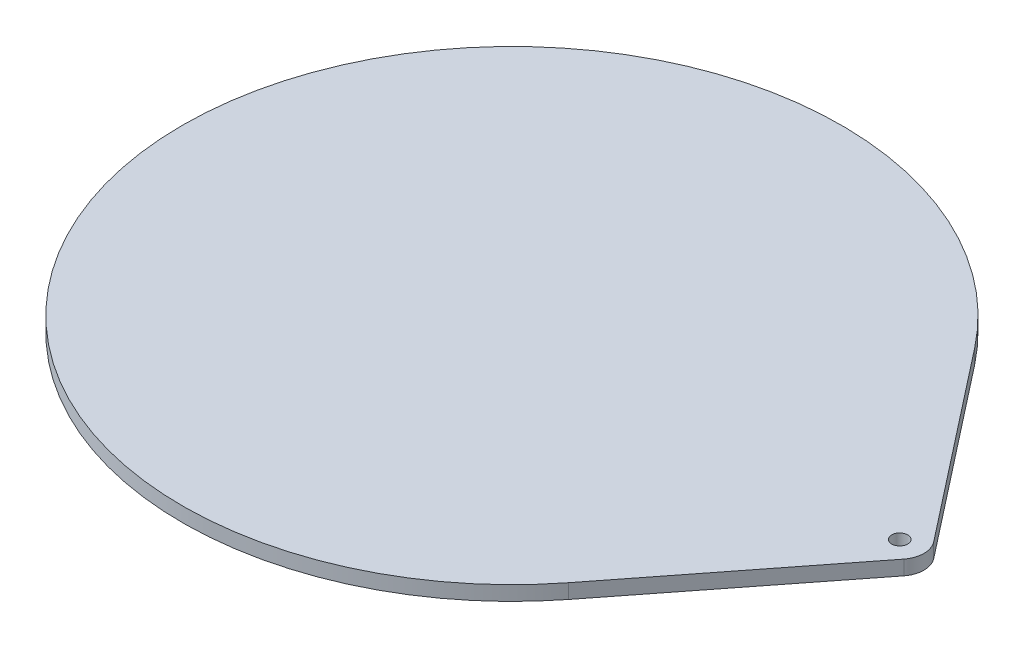
ISO-10303-21;
HEADER;
FILE_DESCRIPTION(('STEP AP214'),'2;1');
FILE_NAME('part.step','',(''),(''),'','','');
FILE_SCHEMA(('AUTOMOTIVE_DESIGN { 1 0 10303 214 1 1 1 1 }'));
ENDSEC;
DATA;
#1=APPLICATION_CONTEXT('core data for automotive mechanical design processes');
#2=APPLICATION_PROTOCOL_DEFINITION('international standard','automotive_design',2000,#1);
#3=PRODUCT_CONTEXT('',#1,'mechanical');
#4=PRODUCT('Part','Part','',(#3));
#5=PRODUCT_RELATED_PRODUCT_CATEGORY('part','',(#4));
#6=PRODUCT_DEFINITION_FORMATION('','',#4);
#7=PRODUCT_DEFINITION_CONTEXT('part definition',#1,'design');
#8=PRODUCT_DEFINITION('design','',#6,#7);
#9=PRODUCT_DEFINITION_SHAPE('','',#8);
#10=(LENGTH_UNIT() NAMED_UNIT(*) SI_UNIT(.MILLI.,.METRE.));
#11=(NAMED_UNIT(*) PLANE_ANGLE_UNIT() SI_UNIT($,.RADIAN.));
#12=(NAMED_UNIT(*) SI_UNIT($,.STERADIAN.) SOLID_ANGLE_UNIT());
#13=UNCERTAINTY_MEASURE_WITH_UNIT(LENGTH_MEASURE(1.E-05),#10,'distance_accuracy_value','');
#14=(GEOMETRIC_REPRESENTATION_CONTEXT(3) GLOBAL_UNCERTAINTY_ASSIGNED_CONTEXT((#13)) GLOBAL_UNIT_ASSIGNED_CONTEXT((#10,
#11,#12)) REPRESENTATION_CONTEXT('',''));
#15=CARTESIAN_POINT('',(0.,0.,0.));
#16=DIRECTION('',(0.,0.,1.));
#17=DIRECTION('',(1.,0.,0.));
#18=AXIS2_PLACEMENT_3D('',#15,#16,#17);
#19=CARTESIAN_POINT('',(0.,3.,0.));
#20=DIRECTION('',(0.,1.,0.));
#21=DIRECTION('',(0.,0.,1.));
#22=AXIS2_PLACEMENT_3D('',#19,#20,#21);
#23=PLANE('',#22);
#24=CARTESIAN_POINT('',(0.,3.,0.));
#25=DIRECTION('',(0.,1.,0.));
#26=DIRECTION('',(0.,0.,1.));
#27=AXIS2_PLACEMENT_3D('',#24,#25,#26);
#28=CIRCLE('',#27,68.);
#29=CARTESIAN_POINT('',(53.55,3.,-41.9093963211116));
#30=VERTEX_POINT('',#29);
#31=CARTESIAN_POINT('',(53.55,3.,41.9093963211116));
#32=VERTEX_POINT('',#31);
#33=EDGE_CURVE('E98',#30,#32,#28,.T.);
#34=ORIENTED_EDGE('',*,*,#33,.T.);
#35=DIRECTION('',(0.616314651781053,0.,-0.7875));
#36=VECTOR('',#35,1.);
#37=CARTESIAN_POINT('',(53.55,3.,41.9093963211116));
#38=LINE('',#37,#36);
#39=CARTESIAN_POINT('',(83.9375,3.,3.08157325890526));
#40=VERTEX_POINT('',#39);
#41=EDGE_CURVE('E93',#32,#40,#38,.T.);
#42=ORIENTED_EDGE('',*,*,#41,.T.);
#43=CARTESIAN_POINT('',(80.,3.,0.));
#44=DIRECTION('',(0.,1.,0.));
#45=DIRECTION('',(0.,0.,1.));
#46=AXIS2_PLACEMENT_3D('',#43,#44,#45);
#47=CIRCLE('',#46,5.);
#48=CARTESIAN_POINT('',(83.9375,3.,-3.08157325890526));
#49=VERTEX_POINT('',#48);
#50=EDGE_CURVE('E96',#40,#49,#47,.T.);
#51=ORIENTED_EDGE('',*,*,#50,.T.);
#52=DIRECTION('',(-0.616314651781053,0.,-0.7875));
#53=VECTOR('',#52,1.);
#54=CARTESIAN_POINT('',(53.55,3.,-41.9093963211116));
#55=LINE('',#54,#53);
#56=EDGE_CURVE('E63',#49,#30,#55,.T.);
#57=ORIENTED_EDGE('',*,*,#56,.T.);
#58=EDGE_LOOP('',(#34,#42,#51,#57));
#59=FACE_BOUND('',#58,.T.);
#60=CARTESIAN_POINT('',(80.,3.,0.));
#61=DIRECTION('',(0.,1.,0.));
#62=DIRECTION('',(0.,0.,1.));
#63=AXIS2_PLACEMENT_3D('',#60,#61,#62);
#64=CIRCLE('',#63,1.65);
#65=CARTESIAN_POINT('',(80.,3.,1.65));
#66=VERTEX_POINT('',#65);
#67=EDGE_CURVE('E118',#66,#66,#64,.T.);
#68=ORIENTED_EDGE('',*,*,#67,.F.);
#69=EDGE_LOOP('',(#68));
#70=FACE_BOUND('',#69,.T.);
#71=ADVANCED_FACE('F45',(#59,#70),#23,.T.);
#72=CARTESIAN_POINT('',(0.,0.,0.));
#73=DIRECTION('',(0.,1.,0.));
#74=DIRECTION('',(0.,0.,1.));
#75=AXIS2_PLACEMENT_3D('',#72,#73,#74);
#76=PLANE('',#75);
#77=CARTESIAN_POINT('',(0.,0.,0.));
#78=DIRECTION('',(0.,1.,0.));
#79=DIRECTION('',(0.,0.,1.));
#80=AXIS2_PLACEMENT_3D('',#77,#78,#79);
#81=CIRCLE('',#80,68.);
#82=CARTESIAN_POINT('',(53.55,0.,-41.9093963211116));
#83=VERTEX_POINT('',#82);
#84=CARTESIAN_POINT('',(53.55,0.,41.9093963211116));
#85=VERTEX_POINT('',#84);
#86=EDGE_CURVE('E114',#83,#85,#81,.T.);
#87=ORIENTED_EDGE('',*,*,#86,.F.);
#88=DIRECTION('',(-0.616314651781053,0.,-0.7875));
#89=VECTOR('',#88,1.);
#90=CARTESIAN_POINT('',(53.55,0.,-41.9093963211116));
#91=LINE('',#90,#89);
#92=CARTESIAN_POINT('',(83.9375,0.,-3.08157325890526));
#93=VERTEX_POINT('',#92);
#94=EDGE_CURVE('E86',#93,#83,#91,.T.);
#95=ORIENTED_EDGE('',*,*,#94,.F.);
#96=CARTESIAN_POINT('',(80.,0.,0.));
#97=DIRECTION('',(0.,1.,0.));
#98=DIRECTION('',(0.,0.,1.));
#99=AXIS2_PLACEMENT_3D('',#96,#97,#98);
#100=CIRCLE('',#99,5.);
#101=CARTESIAN_POINT('',(83.9375,0.,3.08157325890526));
#102=VERTEX_POINT('',#101);
#103=EDGE_CURVE('E80',#102,#93,#100,.T.);
#104=ORIENTED_EDGE('',*,*,#103,.F.);
#105=DIRECTION('',(0.616314651781053,0.,-0.7875));
#106=VECTOR('',#105,1.);
#107=CARTESIAN_POINT('',(53.55,0.,41.9093963211116));
#108=LINE('',#107,#106);
#109=EDGE_CURVE('E103',#85,#102,#108,.T.);
#110=ORIENTED_EDGE('',*,*,#109,.F.);
#111=EDGE_LOOP('',(#87,#95,#104,#110));
#112=FACE_BOUND('',#111,.T.);
#113=CARTESIAN_POINT('',(80.,0.,0.));
#114=DIRECTION('',(0.,1.,0.));
#115=DIRECTION('',(0.,0.,1.));
#116=AXIS2_PLACEMENT_3D('',#113,#114,#115);
#117=CIRCLE('',#116,1.65);
#118=CARTESIAN_POINT('',(80.,0.,1.65));
#119=VERTEX_POINT('',#118);
#120=EDGE_CURVE('E136',#119,#119,#117,.T.);
#121=ORIENTED_EDGE('',*,*,#120,.T.);
#122=EDGE_LOOP('',(#121));
#123=FACE_BOUND('',#122,.T.);
#124=ADVANCED_FACE('F131',(#112,#123),#76,.F.);
#125=CARTESIAN_POINT('',(0.,3.,0.));
#126=DIRECTION('',(0.,-1.,0.));
#127=DIRECTION('',(0.,0.,-1.));
#128=AXIS2_PLACEMENT_3D('',#125,#126,#127);
#129=CYLINDRICAL_SURFACE('',#128,68.);
#130=ORIENTED_EDGE('',*,*,#86,.T.);
#131=DIRECTION('',(0.,-1.,0.));
#132=VECTOR('',#131,1.);
#133=CARTESIAN_POINT('',(53.55,3.,41.9093963211116));
#134=LINE('',#133,#132);
#135=EDGE_CURVE('E11',#32,#85,#134,.T.);
#136=ORIENTED_EDGE('',*,*,#135,.F.);
#137=ORIENTED_EDGE('',*,*,#33,.F.);
#138=DIRECTION('',(0.,-1.,0.));
#139=VECTOR('',#138,1.);
#140=CARTESIAN_POINT('',(53.55,3.,-41.9093963211116));
#141=LINE('',#140,#139);
#142=EDGE_CURVE('E110',#30,#83,#141,.T.);
#143=ORIENTED_EDGE('',*,*,#142,.T.);
#144=EDGE_LOOP('',(#130,#136,#137,#143));
#145=FACE_BOUND('',#144,.T.);
#146=ADVANCED_FACE('F47',(#145),#129,.T.);
#147=CARTESIAN_POINT('',(53.55,3.,41.9093963211116));
#148=DIRECTION('',(-0.7875,0.,-0.616314651781053));
#149=DIRECTION('',(-0.616314651781053,0.,0.7875));
#150=AXIS2_PLACEMENT_3D('',#147,#148,#149);
#151=PLANE('',#150);
#152=ORIENTED_EDGE('',*,*,#109,.T.);
#153=DIRECTION('',(0.,-1.,0.));
#154=VECTOR('',#153,1.);
#155=CARTESIAN_POINT('',(83.9375,3.,3.08157325890526));
#156=LINE('',#155,#154);
#157=EDGE_CURVE('E55',#40,#102,#156,.T.);
#158=ORIENTED_EDGE('',*,*,#157,.F.);
#159=ORIENTED_EDGE('',*,*,#41,.F.);
#160=ORIENTED_EDGE('',*,*,#135,.T.);
#161=EDGE_LOOP('',(#152,#158,#159,#160));
#162=FACE_BOUND('',#161,.T.);
#163=ADVANCED_FACE('F102',(#162),#151,.F.);
#164=CARTESIAN_POINT('',(80.,3.,0.));
#165=DIRECTION('',(0.,-1.,0.));
#166=DIRECTION('',(0.,0.,-1.));
#167=AXIS2_PLACEMENT_3D('',#164,#165,#166);
#168=CYLINDRICAL_SURFACE('',#167,5.);
#169=ORIENTED_EDGE('',*,*,#103,.T.);
#170=DIRECTION('',(0.,-1.,0.));
#171=VECTOR('',#170,1.);
#172=CARTESIAN_POINT('',(83.9375,3.,-3.08157325890526));
#173=LINE('',#172,#171);
#174=EDGE_CURVE('E105',#49,#93,#173,.T.);
#175=ORIENTED_EDGE('',*,*,#174,.F.);
#176=ORIENTED_EDGE('',*,*,#50,.F.);
#177=ORIENTED_EDGE('',*,*,#157,.T.);
#178=EDGE_LOOP('',(#169,#175,#176,#177));
#179=FACE_BOUND('',#178,.T.);
#180=ADVANCED_FACE('F106',(#179),#168,.T.);
#181=CARTESIAN_POINT('',(53.55,3.,-41.9093963211116));
#182=DIRECTION('',(-0.7875,0.,0.616314651781053));
#183=DIRECTION('',(0.616314651781053,0.,0.7875));
#184=AXIS2_PLACEMENT_3D('',#181,#182,#183);
#185=PLANE('',#184);
#186=ORIENTED_EDGE('',*,*,#94,.T.);
#187=ORIENTED_EDGE('',*,*,#142,.F.);
#188=ORIENTED_EDGE('',*,*,#56,.F.);
#189=ORIENTED_EDGE('',*,*,#174,.T.);
#190=EDGE_LOOP('',(#186,#187,#188,#189));
#191=FACE_BOUND('',#190,.T.);
#192=ADVANCED_FACE('F128',(#191),#185,.F.);
#193=CARTESIAN_POINT('',(80.,3.,0.));
#194=DIRECTION('',(0.,-1.,0.));
#195=DIRECTION('',(0.,0.,-1.));
#196=AXIS2_PLACEMENT_3D('',#193,#194,#195);
#197=CYLINDRICAL_SURFACE('',#196,1.65);
#198=ORIENTED_EDGE('',*,*,#67,.T.);
#199=EDGE_LOOP('',(#198));
#200=FACE_BOUND('',#199,.T.);
#201=ORIENTED_EDGE('',*,*,#120,.F.);
#202=EDGE_LOOP('',(#201));
#203=FACE_BOUND('',#202,.T.);
#204=ADVANCED_FACE('F144',(#200,#203),#197,.F.);
#205=CLOSED_SHELL('',(#71,#124,#146,#163,#180,#192,#204));
#206=MANIFOLD_SOLID_BREP('B2',#205);
#207=ADVANCED_BREP_SHAPE_REPRESENTATION('',(#18,#206),#14);
#208=SHAPE_DEFINITION_REPRESENTATION(#9,#207);
ENDSEC;
END-ISO-10303-21;
